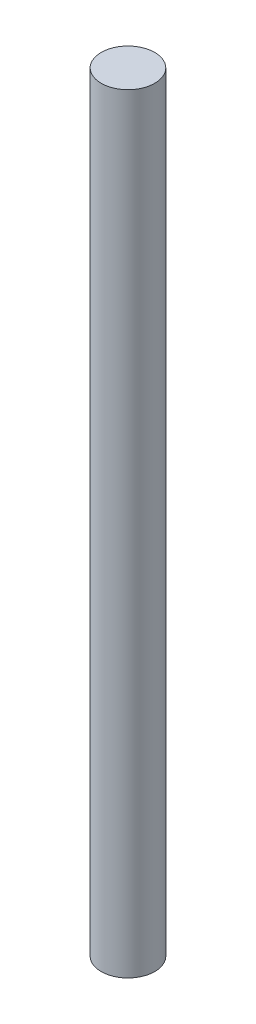
ISO-10303-21;
HEADER;
FILE_DESCRIPTION(('STEP AP214'),'2;1');
FILE_NAME('part.step','',(''),(''),'','','');
FILE_SCHEMA(('AUTOMOTIVE_DESIGN { 1 0 10303 214 1 1 1 1 }'));
ENDSEC;
DATA;
#1=APPLICATION_CONTEXT('core data for automotive mechanical design processes');
#2=APPLICATION_PROTOCOL_DEFINITION('international standard','automotive_design',2000,#1);
#3=PRODUCT_CONTEXT('',#1,'mechanical');
#4=PRODUCT('Part','Part','',(#3));
#5=PRODUCT_RELATED_PRODUCT_CATEGORY('part','',(#4));
#6=PRODUCT_DEFINITION_FORMATION('','',#4);
#7=PRODUCT_DEFINITION_CONTEXT('part definition',#1,'design');
#8=PRODUCT_DEFINITION('design','',#6,#7);
#9=PRODUCT_DEFINITION_SHAPE('','',#8);
#10=(LENGTH_UNIT() NAMED_UNIT(*) SI_UNIT(.MILLI.,.METRE.));
#11=(NAMED_UNIT(*) PLANE_ANGLE_UNIT() SI_UNIT($,.RADIAN.));
#12=(NAMED_UNIT(*) SI_UNIT($,.STERADIAN.) SOLID_ANGLE_UNIT());
#13=UNCERTAINTY_MEASURE_WITH_UNIT(LENGTH_MEASURE(1.E-05),#10,'distance_accuracy_value','');
#14=(GEOMETRIC_REPRESENTATION_CONTEXT(3) GLOBAL_UNCERTAINTY_ASSIGNED_CONTEXT((#13)) GLOBAL_UNIT_ASSIGNED_CONTEXT((#10,
#11,#12)) REPRESENTATION_CONTEXT('',''));
#15=CARTESIAN_POINT('',(0.,0.,0.));
#16=DIRECTION('',(0.,0.,1.));
#17=DIRECTION('',(1.,0.,0.));
#18=AXIS2_PLACEMENT_3D('',#15,#16,#17);
#19=CARTESIAN_POINT('',(0.,230.,0.));
#20=DIRECTION('',(0.,-1.,0.));
#21=DIRECTION('',(0.,0.,-1.));
#22=AXIS2_PLACEMENT_3D('',#19,#20,#21);
#23=CYLINDRICAL_SURFACE('',#22,8.);
#24=CARTESIAN_POINT('',(0.,230.,0.));
#25=DIRECTION('',(0.,1.,0.));
#26=DIRECTION('',(0.,0.,1.));
#27=AXIS2_PLACEMENT_3D('',#24,#25,#26);
#28=CIRCLE('',#27,8.);
#29=CARTESIAN_POINT('',(0.,230.,8.));
#30=VERTEX_POINT('',#29);
#31=EDGE_CURVE('E10',#30,#30,#28,.T.);
#32=ORIENTED_EDGE('',*,*,#31,.F.);
#33=EDGE_LOOP('',(#32));
#34=FACE_BOUND('',#33,.T.);
#35=CARTESIAN_POINT('',(0.,0.,0.));
#36=DIRECTION('',(0.,1.,0.));
#37=DIRECTION('',(0.,0.,1.));
#38=AXIS2_PLACEMENT_3D('',#35,#36,#37);
#39=CIRCLE('',#38,8.);
#40=CARTESIAN_POINT('',(0.,0.,8.));
#41=VERTEX_POINT('',#40);
#42=EDGE_CURVE('E35',#41,#41,#39,.T.);
#43=ORIENTED_EDGE('',*,*,#42,.T.);
#44=EDGE_LOOP('',(#43));
#45=FACE_BOUND('',#44,.T.);
#46=ADVANCED_FACE('F32',(#34,#45),#23,.T.);
#47=CARTESIAN_POINT('',(0.,230.,0.));
#48=DIRECTION('',(0.,1.,0.));
#49=DIRECTION('',(0.,0.,1.));
#50=AXIS2_PLACEMENT_3D('',#47,#48,#49);
#51=PLANE('',#50);
#52=ORIENTED_EDGE('',*,*,#31,.T.);
#53=EDGE_LOOP('',(#52));
#54=FACE_BOUND('',#53,.T.);
#55=ADVANCED_FACE('F47',(#54),#51,.T.);
#56=CARTESIAN_POINT('',(0.,0.,0.));
#57=DIRECTION('',(0.,1.,0.));
#58=DIRECTION('',(0.,0.,1.));
#59=AXIS2_PLACEMENT_3D('',#56,#57,#58);
#60=PLANE('',#59);
#61=ORIENTED_EDGE('',*,*,#42,.F.);
#62=EDGE_LOOP('',(#61));
#63=FACE_BOUND('',#62,.T.);
#64=ADVANCED_FACE('F45',(#63),#60,.F.);
#65=CLOSED_SHELL('',(#46,#55,#64));
#66=MANIFOLD_SOLID_BREP('B2',#65);
#67=ADVANCED_BREP_SHAPE_REPRESENTATION('',(#18,#66),#14);
#68=SHAPE_DEFINITION_REPRESENTATION(#9,#67);
ENDSEC;
END-ISO-10303-21;
